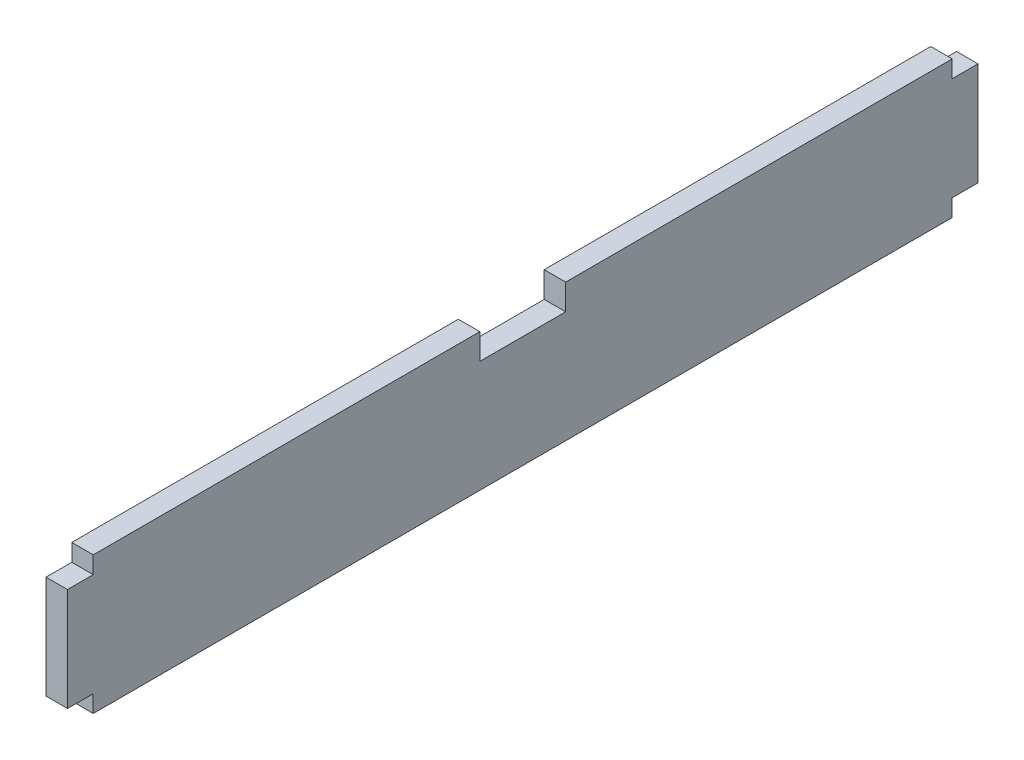
ISO-10303-21;
HEADER;
FILE_DESCRIPTION(('STEP AP214'),'2;1');
FILE_NAME('part.step','',(''),(''),'','','');
FILE_SCHEMA(('AUTOMOTIVE_DESIGN { 1 0 10303 214 1 1 1 1 }'));
ENDSEC;
DATA;
#1=APPLICATION_CONTEXT('core data for automotive mechanical design processes');
#2=APPLICATION_PROTOCOL_DEFINITION('international standard','automotive_design',2000,#1);
#3=PRODUCT_CONTEXT('',#1,'mechanical');
#4=PRODUCT('Part','Part','',(#3));
#5=PRODUCT_RELATED_PRODUCT_CATEGORY('part','',(#4));
#6=PRODUCT_DEFINITION_FORMATION('','',#4);
#7=PRODUCT_DEFINITION_CONTEXT('part definition',#1,'design');
#8=PRODUCT_DEFINITION('design','',#6,#7);
#9=PRODUCT_DEFINITION_SHAPE('','',#8);
#10=(LENGTH_UNIT() NAMED_UNIT(*) SI_UNIT(.MILLI.,.METRE.));
#11=(NAMED_UNIT(*) PLANE_ANGLE_UNIT() SI_UNIT($,.RADIAN.));
#12=(NAMED_UNIT(*) SI_UNIT($,.STERADIAN.) SOLID_ANGLE_UNIT());
#13=UNCERTAINTY_MEASURE_WITH_UNIT(LENGTH_MEASURE(1.E-05),#10,'distance_accuracy_value','');
#14=(GEOMETRIC_REPRESENTATION_CONTEXT(3) GLOBAL_UNCERTAINTY_ASSIGNED_CONTEXT((#13)) GLOBAL_UNIT_ASSIGNED_CONTEXT((#10,
#11,#12)) REPRESENTATION_CONTEXT('',''));
#15=CARTESIAN_POINT('',(0.,0.,0.));
#16=DIRECTION('',(0.,0.,1.));
#17=DIRECTION('',(1.,0.,0.));
#18=AXIS2_PLACEMENT_3D('',#15,#16,#17);
#19=CARTESIAN_POINT('',(0.,8.,100.));
#20=DIRECTION('',(0.,1.,0.));
#21=DIRECTION('',(0.,0.,1.));
#22=AXIS2_PLACEMENT_3D('',#19,#20,#21);
#23=PLANE('',#22);
#24=DIRECTION('',(1.,0.,0.));
#25=VECTOR('',#24,1.);
#26=CARTESIAN_POINT('',(0.,8.,55.));
#27=LINE('',#26,#25);
#28=CARTESIAN_POINT('',(-1.25,8.,55.));
#29=VERTEX_POINT('',#28);
#30=CARTESIAN_POINT('',(1.25,8.,55.));
#31=VERTEX_POINT('',#30);
#32=EDGE_CURVE('E11',#29,#31,#27,.T.);
#33=ORIENTED_EDGE('',*,*,#32,.F.);
#34=DIRECTION('',(0.,0.,-1.));
#35=VECTOR('',#34,1.);
#36=CARTESIAN_POINT('',(-1.25,8.,100.));
#37=LINE('',#36,#35);
#38=CARTESIAN_POINT('',(-1.25,8.,100.));
#39=VERTEX_POINT('',#38);
#40=EDGE_CURVE('E260',#39,#29,#37,.T.);
#41=ORIENTED_EDGE('',*,*,#40,.F.);
#42=DIRECTION('',(1.,0.,0.));
#43=VECTOR('',#42,1.);
#44=CARTESIAN_POINT('',(0.,8.,100.));
#45=LINE('',#44,#43);
#46=CARTESIAN_POINT('',(1.25,8.,100.));
#47=VERTEX_POINT('',#46);
#48=EDGE_CURVE('E244',#39,#47,#45,.T.);
#49=ORIENTED_EDGE('',*,*,#48,.T.);
#50=DIRECTION('',(0.,0.,-1.));
#51=VECTOR('',#50,1.);
#52=CARTESIAN_POINT('',(1.25,8.,100.));
#53=LINE('',#52,#51);
#54=EDGE_CURVE('E264',#47,#31,#53,.T.);
#55=ORIENTED_EDGE('',*,*,#54,.T.);
#56=EDGE_LOOP('',(#33,#41,#49,#55));
#57=FACE_BOUND('',#56,.T.);
#58=ADVANCED_FACE('F38',(#57),#23,.T.);
#59=CARTESIAN_POINT('',(0.,0.,100.));
#60=DIRECTION('',(0.,0.,1.));
#61=DIRECTION('',(1.,0.,0.));
#62=AXIS2_PLACEMENT_3D('',#59,#60,#61);
#63=PLANE('',#62);
#64=DIRECTION('',(0.,-1.,0.));
#65=VECTOR('',#64,1.);
#66=CARTESIAN_POINT('',(1.25,0.,100.));
#67=LINE('',#66,#65);
#68=CARTESIAN_POINT('',(1.25,-6.,100.));
#69=VERTEX_POINT('',#68);
#70=CARTESIAN_POINT('',(1.25,-8.,100.));
#71=VERTEX_POINT('',#70);
#72=EDGE_CURVE('E240',#69,#71,#67,.T.);
#73=ORIENTED_EDGE('',*,*,#72,.F.);
#74=DIRECTION('',(-1.,0.,0.));
#75=VECTOR('',#74,1.);
#76=CARTESIAN_POINT('',(0.,-6.,100.));
#77=LINE('',#76,#75);
#78=CARTESIAN_POINT('',(-1.25,-6.,100.));
#79=VERTEX_POINT('',#78);
#80=EDGE_CURVE('E182',#69,#79,#77,.T.);
#81=ORIENTED_EDGE('',*,*,#80,.T.);
#82=DIRECTION('',(0.,-1.,0.));
#83=VECTOR('',#82,1.);
#84=CARTESIAN_POINT('',(-1.25,0.,100.));
#85=LINE('',#84,#83);
#86=CARTESIAN_POINT('',(-1.25,-8.,100.));
#87=VERTEX_POINT('',#86);
#88=EDGE_CURVE('E237',#79,#87,#85,.T.);
#89=ORIENTED_EDGE('',*,*,#88,.T.);
#90=DIRECTION('',(1.,0.,0.));
#91=VECTOR('',#90,1.);
#92=CARTESIAN_POINT('',(0.,-8.,100.));
#93=LINE('',#92,#91);
#94=EDGE_CURVE('E236',#87,#71,#93,.T.);
#95=ORIENTED_EDGE('',*,*,#94,.T.);
#96=EDGE_LOOP('',(#73,#81,#89,#95));
#97=FACE_BOUND('',#96,.T.);
#98=ADVANCED_FACE('F307',(#97),#63,.T.);
#99=CARTESIAN_POINT('',(-1.25,6.,100.));
#100=VERTEX_POINT('',#99);
#101=EDGE_CURVE('E233',#39,#100,#85,.T.);
#102=ORIENTED_EDGE('',*,*,#101,.T.);
#103=DIRECTION('',(1.,0.,0.));
#104=VECTOR('',#103,1.);
#105=CARTESIAN_POINT('',(0.,6.,100.));
#106=LINE('',#105,#104);
#107=CARTESIAN_POINT('',(1.25,6.,100.));
#108=VERTEX_POINT('',#107);
#109=EDGE_CURVE('E187',#100,#108,#106,.T.);
#110=ORIENTED_EDGE('',*,*,#109,.T.);
#111=EDGE_CURVE('E241',#47,#108,#67,.T.);
#112=ORIENTED_EDGE('',*,*,#111,.F.);
#113=ORIENTED_EDGE('',*,*,#48,.F.);
#114=EDGE_LOOP('',(#102,#110,#112,#113));
#115=FACE_BOUND('',#114,.T.);
#116=ADVANCED_FACE('F321',(#115),#63,.T.);
#117=CARTESIAN_POINT('',(0.,0.,0.));
#118=DIRECTION('',(0.,0.,1.));
#119=DIRECTION('',(1.,0.,0.));
#120=AXIS2_PLACEMENT_3D('',#117,#118,#119);
#121=PLANE('',#120);
#122=DIRECTION('',(-1.,0.,0.));
#123=VECTOR('',#122,1.);
#124=CARTESIAN_POINT('',(0.,-6.,0.));
#125=LINE('',#124,#123);
#126=CARTESIAN_POINT('',(1.25,-6.,0.));
#127=VERTEX_POINT('',#126);
#128=CARTESIAN_POINT('',(-1.25,-6.,0.));
#129=VERTEX_POINT('',#128);
#130=EDGE_CURVE('E201',#127,#129,#125,.T.);
#131=ORIENTED_EDGE('',*,*,#130,.F.);
#132=DIRECTION('',(0.,-1.,0.));
#133=VECTOR('',#132,1.);
#134=CARTESIAN_POINT('',(1.25,0.,0.));
#135=LINE('',#134,#133);
#136=CARTESIAN_POINT('',(1.25,-8.,0.));
#137=VERTEX_POINT('',#136);
#138=EDGE_CURVE('E254',#127,#137,#135,.T.);
#139=ORIENTED_EDGE('',*,*,#138,.T.);
#140=DIRECTION('',(1.,0.,0.));
#141=VECTOR('',#140,1.);
#142=CARTESIAN_POINT('',(0.,-8.,0.));
#143=LINE('',#142,#141);
#144=CARTESIAN_POINT('',(-1.25,-8.,0.));
#145=VERTEX_POINT('',#144);
#146=EDGE_CURVE('E251',#145,#137,#143,.T.);
#147=ORIENTED_EDGE('',*,*,#146,.F.);
#148=DIRECTION('',(0.,-1.,0.));
#149=VECTOR('',#148,1.);
#150=CARTESIAN_POINT('',(-1.25,0.,0.));
#151=LINE('',#150,#149);
#152=EDGE_CURVE('E224',#129,#145,#151,.T.);
#153=ORIENTED_EDGE('',*,*,#152,.F.);
#154=EDGE_LOOP('',(#131,#139,#147,#153));
#155=FACE_BOUND('',#154,.T.);
#156=ADVANCED_FACE('F298',(#155),#121,.F.);
#157=DIRECTION('',(1.,0.,0.));
#158=VECTOR('',#157,1.);
#159=CARTESIAN_POINT('',(0.,6.,0.));
#160=LINE('',#159,#158);
#161=CARTESIAN_POINT('',(-1.25,6.,0.));
#162=VERTEX_POINT('',#161);
#163=CARTESIAN_POINT('',(1.25,6.,0.));
#164=VERTEX_POINT('',#163);
#165=EDGE_CURVE('E210',#162,#164,#160,.T.);
#166=ORIENTED_EDGE('',*,*,#165,.F.);
#167=CARTESIAN_POINT('',(-1.25,8.,0.));
#168=VERTEX_POINT('',#167);
#169=EDGE_CURVE('E248',#168,#162,#151,.T.);
#170=ORIENTED_EDGE('',*,*,#169,.F.);
#171=DIRECTION('',(1.,0.,0.));
#172=VECTOR('',#171,1.);
#173=CARTESIAN_POINT('',(0.,8.,0.));
#174=LINE('',#173,#172);
#175=CARTESIAN_POINT('',(1.25,8.,0.));
#176=VERTEX_POINT('',#175);
#177=EDGE_CURVE('E257',#168,#176,#174,.T.);
#178=ORIENTED_EDGE('',*,*,#177,.T.);
#179=EDGE_CURVE('E255',#176,#164,#135,.T.);
#180=ORIENTED_EDGE('',*,*,#179,.T.);
#181=EDGE_LOOP('',(#166,#170,#178,#180));
#182=FACE_BOUND('',#181,.T.);
#183=ADVANCED_FACE('F280',(#182),#121,.F.);
#184=CARTESIAN_POINT('',(-1.25,0.,100.));
#185=DIRECTION('',(1.,0.,0.));
#186=DIRECTION('',(0.,1.,0.));
#187=AXIS2_PLACEMENT_3D('',#184,#185,#186);
#188=PLANE('',#187);
#189=ORIENTED_EDGE('',*,*,#40,.T.);
#190=DIRECTION('',(0.,-1.,0.));
#191=VECTOR('',#190,1.);
#192=CARTESIAN_POINT('',(-1.25,0.,55.));
#193=LINE('',#192,#191);
#194=CARTESIAN_POINT('',(-1.25,5.,55.));
#195=VERTEX_POINT('',#194);
#196=EDGE_CURVE('E179',#29,#195,#193,.T.);
#197=ORIENTED_EDGE('',*,*,#196,.T.);
#198=DIRECTION('',(0.,0.,-1.));
#199=VECTOR('',#198,1.);
#200=CARTESIAN_POINT('',(-1.25,4.99999999999997,100.));
#201=LINE('',#200,#199);
#202=CARTESIAN_POINT('',(-1.25,5.,45.));
#203=VERTEX_POINT('',#202);
#204=EDGE_CURVE('E158',#195,#203,#201,.T.);
#205=ORIENTED_EDGE('',*,*,#204,.T.);
#206=DIRECTION('',(0.,1.,0.));
#207=VECTOR('',#206,1.);
#208=CARTESIAN_POINT('',(-1.25,0.,45.));
#209=LINE('',#208,#207);
#210=CARTESIAN_POINT('',(-1.25,8.,45.));
#211=VERTEX_POINT('',#210);
#212=EDGE_CURVE('E175',#203,#211,#209,.T.);
#213=ORIENTED_EDGE('',*,*,#212,.T.);
#214=EDGE_CURVE('E247',#211,#168,#37,.T.);
#215=ORIENTED_EDGE('',*,*,#214,.T.);
#216=ORIENTED_EDGE('',*,*,#169,.T.);
#217=DIRECTION('',(0.,0.,1.));
#218=VECTOR('',#217,1.);
#219=CARTESIAN_POINT('',(-1.25,6.,-3.));
#220=LINE('',#219,#218);
#221=CARTESIAN_POINT('',(-1.25,6.,-3.));
#222=VERTEX_POINT('',#221);
#223=EDGE_CURVE('E225',#222,#162,#220,.T.);
#224=ORIENTED_EDGE('',*,*,#223,.F.);
#225=DIRECTION('',(0.,1.,0.));
#226=VECTOR('',#225,1.);
#227=CARTESIAN_POINT('',(-1.25,0.,-3.));
#228=LINE('',#227,#226);
#229=CARTESIAN_POINT('',(-1.25,-6.,-3.));
#230=VERTEX_POINT('',#229);
#231=EDGE_CURVE('E214',#230,#222,#228,.T.);
#232=ORIENTED_EDGE('',*,*,#231,.F.);
#233=DIRECTION('',(0.,0.,1.));
#234=VECTOR('',#233,1.);
#235=CARTESIAN_POINT('',(-1.25,-6.,-3.));
#236=LINE('',#235,#234);
#237=EDGE_CURVE('E221',#230,#129,#236,.T.);
#238=ORIENTED_EDGE('',*,*,#237,.T.);
#239=ORIENTED_EDGE('',*,*,#152,.T.);
#240=DIRECTION('',(0.,0.,-1.));
#241=VECTOR('',#240,1.);
#242=CARTESIAN_POINT('',(-1.25,-8.,100.));
#243=LINE('',#242,#241);
#244=EDGE_CURVE('E269',#87,#145,#243,.T.);
#245=ORIENTED_EDGE('',*,*,#244,.F.);
#246=ORIENTED_EDGE('',*,*,#88,.F.);
#247=DIRECTION('',(0.,0.,-1.));
#248=VECTOR('',#247,1.);
#249=CARTESIAN_POINT('',(-1.25,-6.,103.));
#250=LINE('',#249,#248);
#251=CARTESIAN_POINT('',(-1.25,-6.,103.));
#252=VERTEX_POINT('',#251);
#253=EDGE_CURVE('E195',#252,#79,#250,.T.);
#254=ORIENTED_EDGE('',*,*,#253,.F.);
#255=DIRECTION('',(0.,1.,0.));
#256=VECTOR('',#255,1.);
#257=CARTESIAN_POINT('',(-1.25,0.,103.));
#258=LINE('',#257,#256);
#259=CARTESIAN_POINT('',(-1.25,6.,103.));
#260=VERTEX_POINT('',#259);
#261=EDGE_CURVE('E186',#252,#260,#258,.T.);
#262=ORIENTED_EDGE('',*,*,#261,.T.);
#263=DIRECTION('',(0.,0.,-1.));
#264=VECTOR('',#263,1.);
#265=CARTESIAN_POINT('',(-1.25,6.,103.));
#266=LINE('',#265,#264);
#267=EDGE_CURVE('E203',#260,#100,#266,.T.);
#268=ORIENTED_EDGE('',*,*,#267,.T.);
#269=ORIENTED_EDGE('',*,*,#101,.F.);
#270=EDGE_LOOP('',(#189,#197,#205,#213,#215,#216,#224,#232,#238,#239,#245,#246,#254,#262,#268,#269));
#271=FACE_BOUND('',#270,.T.);
#272=ADVANCED_FACE('F40',(#271),#188,.F.);
#273=CARTESIAN_POINT('',(0.,-8.,100.));
#274=DIRECTION('',(0.,1.,0.));
#275=DIRECTION('',(0.,0.,1.));
#276=AXIS2_PLACEMENT_3D('',#273,#274,#275);
#277=PLANE('',#276);
#278=ORIENTED_EDGE('',*,*,#146,.T.);
#279=DIRECTION('',(0.,0.,-1.));
#280=VECTOR('',#279,1.);
#281=CARTESIAN_POINT('',(1.25,-8.,100.));
#282=LINE('',#281,#280);
#283=EDGE_CURVE('E266',#71,#137,#282,.T.);
#284=ORIENTED_EDGE('',*,*,#283,.F.);
#285=ORIENTED_EDGE('',*,*,#94,.F.);
#286=ORIENTED_EDGE('',*,*,#244,.T.);
#287=EDGE_LOOP('',(#278,#284,#285,#286));
#288=FACE_BOUND('',#287,.T.);
#289=ADVANCED_FACE('F303',(#288),#277,.F.);
#290=CARTESIAN_POINT('',(1.25,0.,100.));
#291=DIRECTION('',(1.,0.,0.));
#292=DIRECTION('',(0.,1.,0.));
#293=AXIS2_PLACEMENT_3D('',#290,#291,#292);
#294=PLANE('',#293);
#295=DIRECTION('',(0.,-1.,0.));
#296=VECTOR('',#295,1.);
#297=CARTESIAN_POINT('',(1.25,8.,55.));
#298=LINE('',#297,#296);
#299=CARTESIAN_POINT('',(1.25,5.,55.));
#300=VERTEX_POINT('',#299);
#301=EDGE_CURVE('E164',#31,#300,#298,.T.);
#302=ORIENTED_EDGE('',*,*,#301,.F.);
#303=ORIENTED_EDGE('',*,*,#54,.F.);
#304=ORIENTED_EDGE('',*,*,#111,.T.);
#305=DIRECTION('',(0.,0.,-1.));
#306=VECTOR('',#305,1.);
#307=CARTESIAN_POINT('',(1.25,6.,103.));
#308=LINE('',#307,#306);
#309=CARTESIAN_POINT('',(1.25,6.,103.));
#310=VERTEX_POINT('',#309);
#311=EDGE_CURVE('E61',#310,#108,#308,.T.);
#312=ORIENTED_EDGE('',*,*,#311,.F.);
#313=DIRECTION('',(0.,-1.,0.));
#314=VECTOR('',#313,1.);
#315=CARTESIAN_POINT('',(1.25,0.,103.));
#316=LINE('',#315,#314);
#317=CARTESIAN_POINT('',(1.25,-6.,103.));
#318=VERTEX_POINT('',#317);
#319=EDGE_CURVE('E192',#310,#318,#316,.T.);
#320=ORIENTED_EDGE('',*,*,#319,.T.);
#321=DIRECTION('',(0.,0.,-1.));
#322=VECTOR('',#321,1.);
#323=CARTESIAN_POINT('',(1.25,-6.,103.));
#324=LINE('',#323,#322);
#325=EDGE_CURVE('E199',#318,#69,#324,.T.);
#326=ORIENTED_EDGE('',*,*,#325,.T.);
#327=ORIENTED_EDGE('',*,*,#72,.T.);
#328=ORIENTED_EDGE('',*,*,#283,.T.);
#329=ORIENTED_EDGE('',*,*,#138,.F.);
#330=DIRECTION('',(0.,0.,1.));
#331=VECTOR('',#330,1.);
#332=CARTESIAN_POINT('',(1.25,-6.,-3.));
#333=LINE('',#332,#331);
#334=CARTESIAN_POINT('',(1.25,-6.,-3.));
#335=VERTEX_POINT('',#334);
#336=EDGE_CURVE('E216',#335,#127,#333,.T.);
#337=ORIENTED_EDGE('',*,*,#336,.F.);
#338=DIRECTION('',(0.,-1.,0.));
#339=VECTOR('',#338,1.);
#340=CARTESIAN_POINT('',(1.25,0.,-3.));
#341=LINE('',#340,#339);
#342=CARTESIAN_POINT('',(1.25,6.,-3.));
#343=VERTEX_POINT('',#342);
#344=EDGE_CURVE('E209',#343,#335,#341,.T.);
#345=ORIENTED_EDGE('',*,*,#344,.F.);
#346=DIRECTION('',(0.,0.,1.));
#347=VECTOR('',#346,1.);
#348=CARTESIAN_POINT('',(1.25,6.,-3.));
#349=LINE('',#348,#347);
#350=EDGE_CURVE('E228',#343,#164,#349,.T.);
#351=ORIENTED_EDGE('',*,*,#350,.T.);
#352=ORIENTED_EDGE('',*,*,#179,.F.);
#353=CARTESIAN_POINT('',(1.25,8.,45.));
#354=VERTEX_POINT('',#353);
#355=EDGE_CURVE('E263',#354,#176,#53,.T.);
#356=ORIENTED_EDGE('',*,*,#355,.F.);
#357=DIRECTION('',(0.,1.,0.));
#358=VECTOR('',#357,1.);
#359=CARTESIAN_POINT('',(1.25,8.,45.));
#360=LINE('',#359,#358);
#361=CARTESIAN_POINT('',(1.25,5.,45.));
#362=VERTEX_POINT('',#361);
#363=EDGE_CURVE('E53',#362,#354,#360,.T.);
#364=ORIENTED_EDGE('',*,*,#363,.F.);
#365=DIRECTION('',(0.,0.,-1.));
#366=VECTOR('',#365,1.);
#367=CARTESIAN_POINT('',(1.25,5.,55.));
#368=LINE('',#367,#366);
#369=EDGE_CURVE('E156',#300,#362,#368,.T.);
#370=ORIENTED_EDGE('',*,*,#369,.F.);
#371=EDGE_LOOP('',(#302,#303,#304,#312,#320,#326,#327,#328,#329,#337,#345,#351,#352,#356,#364,#370));
#372=FACE_BOUND('',#371,.T.);
#373=ADVANCED_FACE('F170',(#372),#294,.T.);
#374=DIRECTION('',(-1.,0.,0.));
#375=VECTOR('',#374,1.);
#376=CARTESIAN_POINT('',(0.,8.,45.));
#377=LINE('',#376,#375);
#378=EDGE_CURVE('E46',#354,#211,#377,.T.);
#379=ORIENTED_EDGE('',*,*,#378,.F.);
#380=ORIENTED_EDGE('',*,*,#355,.T.);
#381=ORIENTED_EDGE('',*,*,#177,.F.);
#382=ORIENTED_EDGE('',*,*,#214,.F.);
#383=EDGE_LOOP('',(#379,#380,#381,#382));
#384=FACE_BOUND('',#383,.T.);
#385=ADVANCED_FACE('F277',(#384),#23,.T.);
#386=CARTESIAN_POINT('',(0.,-6.,-3.));
#387=DIRECTION('',(0.,1.,0.));
#388=DIRECTION('',(0.,0.,1.));
#389=AXIS2_PLACEMENT_3D('',#386,#387,#388);
#390=PLANE('',#389);
#391=ORIENTED_EDGE('',*,*,#130,.T.);
#392=ORIENTED_EDGE('',*,*,#237,.F.);
#393=DIRECTION('',(-1.,0.,0.));
#394=VECTOR('',#393,1.);
#395=CARTESIAN_POINT('',(0.,-6.,-3.));
#396=LINE('',#395,#394);
#397=EDGE_CURVE('E206',#335,#230,#396,.T.);
#398=ORIENTED_EDGE('',*,*,#397,.F.);
#399=ORIENTED_EDGE('',*,*,#336,.T.);
#400=EDGE_LOOP('',(#391,#392,#398,#399));
#401=FACE_BOUND('',#400,.T.);
#402=ADVANCED_FACE('F295',(#401),#390,.F.);
#403=CARTESIAN_POINT('',(0.,6.,-3.));
#404=DIRECTION('',(0.,-1.,0.));
#405=DIRECTION('',(1.,0.,0.));
#406=AXIS2_PLACEMENT_3D('',#403,#404,#405);
#407=PLANE('',#406);
#408=ORIENTED_EDGE('',*,*,#165,.T.);
#409=ORIENTED_EDGE('',*,*,#350,.F.);
#410=DIRECTION('',(1.,0.,0.));
#411=VECTOR('',#410,1.);
#412=CARTESIAN_POINT('',(0.,6.,-3.));
#413=LINE('',#412,#411);
#414=EDGE_CURVE('E212',#222,#343,#413,.T.);
#415=ORIENTED_EDGE('',*,*,#414,.F.);
#416=ORIENTED_EDGE('',*,*,#223,.T.);
#417=EDGE_LOOP('',(#408,#409,#415,#416));
#418=FACE_BOUND('',#417,.T.);
#419=ADVANCED_FACE('F284',(#418),#407,.F.);
#420=CARTESIAN_POINT('',(0.,0.,-3.));
#421=DIRECTION('',(0.,0.,1.));
#422=DIRECTION('',(1.,0.,0.));
#423=AXIS2_PLACEMENT_3D('',#420,#421,#422);
#424=PLANE('',#423);
#425=ORIENTED_EDGE('',*,*,#397,.T.);
#426=ORIENTED_EDGE('',*,*,#231,.T.);
#427=ORIENTED_EDGE('',*,*,#414,.T.);
#428=ORIENTED_EDGE('',*,*,#344,.T.);
#429=EDGE_LOOP('',(#425,#426,#427,#428));
#430=FACE_BOUND('',#429,.T.);
#431=ADVANCED_FACE('F288',(#430),#424,.F.);
#432=CARTESIAN_POINT('',(0.,-6.,103.));
#433=DIRECTION('',(0.,-1.,0.));
#434=DIRECTION('',(0.,0.,-1.));
#435=AXIS2_PLACEMENT_3D('',#432,#433,#434);
#436=PLANE('',#435);
#437=ORIENTED_EDGE('',*,*,#80,.F.);
#438=ORIENTED_EDGE('',*,*,#325,.F.);
#439=DIRECTION('',(-1.,0.,0.));
#440=VECTOR('',#439,1.);
#441=CARTESIAN_POINT('',(0.,-6.,103.));
#442=LINE('',#441,#440);
#443=EDGE_CURVE('E183',#318,#252,#442,.T.);
#444=ORIENTED_EDGE('',*,*,#443,.T.);
#445=ORIENTED_EDGE('',*,*,#253,.T.);
#446=EDGE_LOOP('',(#437,#438,#444,#445));
#447=FACE_BOUND('',#446,.T.);
#448=ADVANCED_FACE('F310',(#447),#436,.T.);
#449=CARTESIAN_POINT('',(0.,6.,103.));
#450=DIRECTION('',(0.,1.,0.));
#451=DIRECTION('',(-1.,0.,0.));
#452=AXIS2_PLACEMENT_3D('',#449,#450,#451);
#453=PLANE('',#452);
#454=ORIENTED_EDGE('',*,*,#109,.F.);
#455=ORIENTED_EDGE('',*,*,#267,.F.);
#456=DIRECTION('',(1.,0.,0.));
#457=VECTOR('',#456,1.);
#458=CARTESIAN_POINT('',(0.,6.,103.));
#459=LINE('',#458,#457);
#460=EDGE_CURVE('E190',#260,#310,#459,.T.);
#461=ORIENTED_EDGE('',*,*,#460,.T.);
#462=ORIENTED_EDGE('',*,*,#311,.T.);
#463=EDGE_LOOP('',(#454,#455,#461,#462));
#464=FACE_BOUND('',#463,.T.);
#465=ADVANCED_FACE('F317',(#464),#453,.T.);
#466=CARTESIAN_POINT('',(0.,0.,103.));
#467=DIRECTION('',(0.,0.,-1.));
#468=DIRECTION('',(1.,0.,0.));
#469=AXIS2_PLACEMENT_3D('',#466,#467,#468);
#470=PLANE('',#469);
#471=ORIENTED_EDGE('',*,*,#443,.F.);
#472=ORIENTED_EDGE('',*,*,#319,.F.);
#473=ORIENTED_EDGE('',*,*,#460,.F.);
#474=ORIENTED_EDGE('',*,*,#261,.F.);
#475=EDGE_LOOP('',(#471,#472,#473,#474));
#476=FACE_BOUND('',#475,.T.);
#477=ADVANCED_FACE('F314',(#476),#470,.F.);
#478=CARTESIAN_POINT('',(-8.75,5.,55.));
#479=DIRECTION('',(0.,-1.,0.));
#480=DIRECTION('',(0.,0.,-1.));
#481=AXIS2_PLACEMENT_3D('',#478,#479,#480);
#482=PLANE('',#481);
#483=DIRECTION('',(1.,0.,0.));
#484=VECTOR('',#483,1.);
#485=CARTESIAN_POINT('',(-8.75,5.,55.));
#486=LINE('',#485,#484);
#487=EDGE_CURVE('E151',#195,#300,#486,.T.);
#488=ORIENTED_EDGE('',*,*,#487,.T.);
#489=ORIENTED_EDGE('',*,*,#369,.T.);
#490=DIRECTION('',(1.,0.,0.));
#491=VECTOR('',#490,1.);
#492=CARTESIAN_POINT('',(-8.75,5.,45.));
#493=LINE('',#492,#491);
#494=EDGE_CURVE('E161',#203,#362,#493,.T.);
#495=ORIENTED_EDGE('',*,*,#494,.F.);
#496=ORIENTED_EDGE('',*,*,#204,.F.);
#497=EDGE_LOOP('',(#488,#489,#495,#496));
#498=FACE_BOUND('',#497,.T.);
#499=ADVANCED_FACE('F153',(#498),#482,.F.);
#500=CARTESIAN_POINT('',(-8.75,8.,55.));
#501=DIRECTION('',(0.,0.,1.));
#502=DIRECTION('',(1.,0.,0.));
#503=AXIS2_PLACEMENT_3D('',#500,#501,#502);
#504=PLANE('',#503);
#505=ORIENTED_EDGE('',*,*,#32,.T.);
#506=ORIENTED_EDGE('',*,*,#301,.T.);
#507=ORIENTED_EDGE('',*,*,#487,.F.);
#508=ORIENTED_EDGE('',*,*,#196,.F.);
#509=EDGE_LOOP('',(#505,#506,#507,#508));
#510=FACE_BOUND('',#509,.T.);
#511=ADVANCED_FACE('F165',(#510),#504,.F.);
#512=CARTESIAN_POINT('',(-8.75,8.,45.));
#513=DIRECTION('',(0.,0.,-1.));
#514=DIRECTION('',(-1.,0.,0.));
#515=AXIS2_PLACEMENT_3D('',#512,#513,#514);
#516=PLANE('',#515);
#517=ORIENTED_EDGE('',*,*,#494,.T.);
#518=ORIENTED_EDGE('',*,*,#363,.T.);
#519=ORIENTED_EDGE('',*,*,#378,.T.);
#520=ORIENTED_EDGE('',*,*,#212,.F.);
#521=EDGE_LOOP('',(#517,#518,#519,#520));
#522=FACE_BOUND('',#521,.T.);
#523=ADVANCED_FACE('F271',(#522),#516,.F.);
#524=CLOSED_SHELL('',(#58,#98,#116,#156,#183,#272,#289,#373,#385,#402,#419,#431,#448,#465,#477,
#499,#511,#523));
#525=MANIFOLD_SOLID_BREP('B2',#524);
#526=ADVANCED_BREP_SHAPE_REPRESENTATION('',(#18,#525),#14);
#527=SHAPE_DEFINITION_REPRESENTATION(#9,#526);
ENDSEC;
END-ISO-10303-21;
